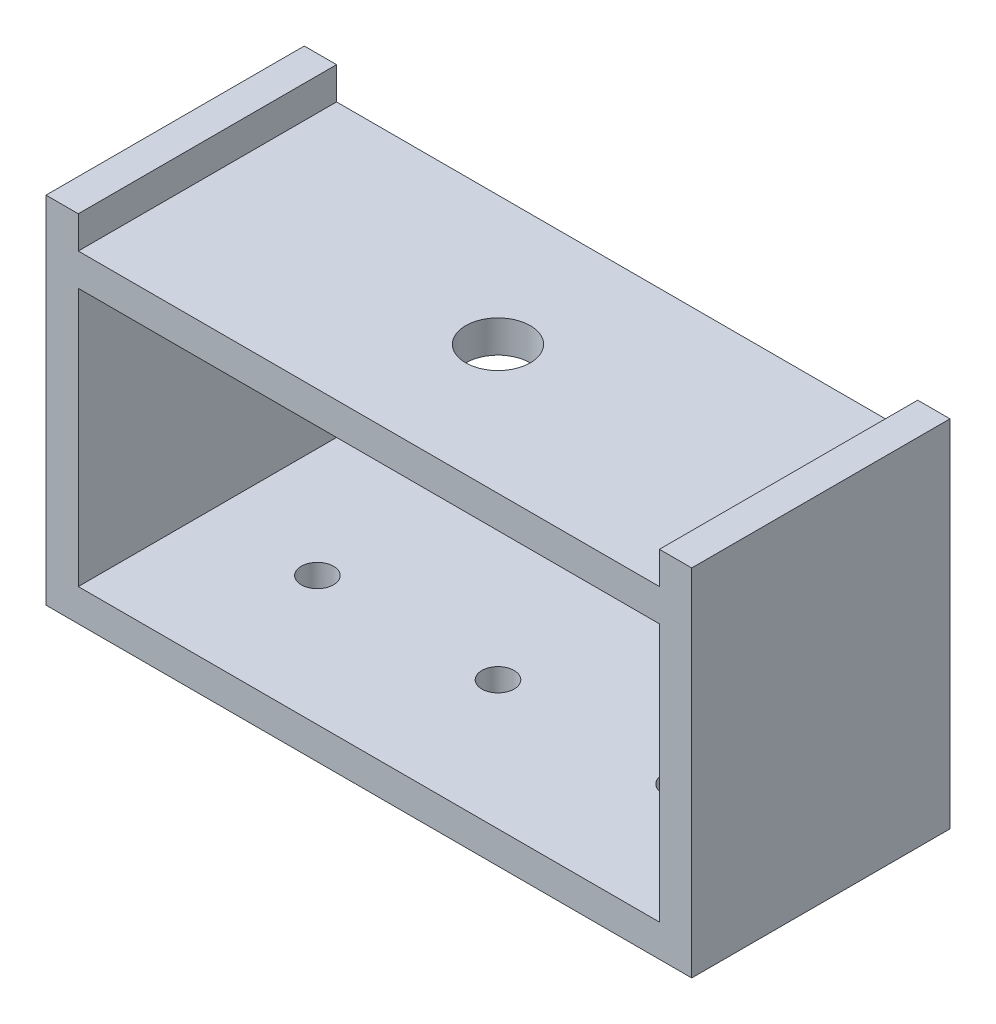
ISO-10303-21;
HEADER;
FILE_DESCRIPTION(('STEP AP214'),'2;1');
FILE_NAME('part.step','',(''),(''),'','','');
FILE_SCHEMA(('AUTOMOTIVE_DESIGN { 1 0 10303 214 1 1 1 1 }'));
ENDSEC;
DATA;
#1=APPLICATION_CONTEXT('core data for automotive mechanical design processes');
#2=APPLICATION_PROTOCOL_DEFINITION('international standard','automotive_design',2000,#1);
#3=PRODUCT_CONTEXT('',#1,'mechanical');
#4=PRODUCT('Part','Part','',(#3));
#5=PRODUCT_RELATED_PRODUCT_CATEGORY('part','',(#4));
#6=PRODUCT_DEFINITION_FORMATION('','',#4);
#7=PRODUCT_DEFINITION_CONTEXT('part definition',#1,'design');
#8=PRODUCT_DEFINITION('design','',#6,#7);
#9=PRODUCT_DEFINITION_SHAPE('','',#8);
#10=(LENGTH_UNIT() NAMED_UNIT(*) SI_UNIT(.MILLI.,.METRE.));
#11=(NAMED_UNIT(*) PLANE_ANGLE_UNIT() SI_UNIT($,.RADIAN.));
#12=(NAMED_UNIT(*) SI_UNIT($,.STERADIAN.) SOLID_ANGLE_UNIT());
#13=UNCERTAINTY_MEASURE_WITH_UNIT(LENGTH_MEASURE(1.E-05),#10,'distance_accuracy_value','');
#14=(GEOMETRIC_REPRESENTATION_CONTEXT(3) GLOBAL_UNCERTAINTY_ASSIGNED_CONTEXT((#13)) GLOBAL_UNIT_ASSIGNED_CONTEXT((#10,
#11,#12)) REPRESENTATION_CONTEXT('',''));
#15=CARTESIAN_POINT('',(0.,0.,0.));
#16=DIRECTION('',(0.,0.,1.));
#17=DIRECTION('',(1.,0.,0.));
#18=AXIS2_PLACEMENT_3D('',#15,#16,#17);
#19=CARTESIAN_POINT('',(127.,31.75,25.4));
#20=DIRECTION('',(0.,-1.,0.));
#21=DIRECTION('',(0.,0.,-1.));
#22=AXIS2_PLACEMENT_3D('',#19,#20,#21);
#23=PLANE('',#22);
#24=CARTESIAN_POINT('',(63.5,31.75,0.));
#25=DIRECTION('',(0.,1.,0.));
#26=DIRECTION('',(0.,0.,1.));
#27=AXIS2_PLACEMENT_3D('',#24,#25,#26);
#28=CIRCLE('',#27,6.35000000000001);
#29=CARTESIAN_POINT('',(63.5,31.75,6.35000000000001));
#30=VERTEX_POINT('',#29);
#31=EDGE_CURVE('E422',#30,#30,#28,.T.);
#32=ORIENTED_EDGE('',*,*,#31,.F.);
#33=EDGE_LOOP('',(#32));
#34=FACE_BOUND('',#33,.T.);
#35=DIRECTION('',(0.,0.,1.));
#36=VECTOR('',#35,1.);
#37=CARTESIAN_POINT('',(120.65,31.75,-25.4));
#38=LINE('',#37,#36);
#39=CARTESIAN_POINT('',(120.65,31.75,-25.4));
#40=VERTEX_POINT('',#39);
#41=CARTESIAN_POINT('',(120.65,31.75,25.4));
#42=VERTEX_POINT('',#41);
#43=EDGE_CURVE('E155',#40,#42,#38,.T.);
#44=ORIENTED_EDGE('',*,*,#43,.F.);
#45=DIRECTION('',(-1.,0.,0.));
#46=VECTOR('',#45,1.);
#47=CARTESIAN_POINT('',(127.,31.75,-25.4));
#48=LINE('',#47,#46);
#49=CARTESIAN_POINT('',(6.35,31.75,-25.4));
#50=VERTEX_POINT('',#49);
#51=EDGE_CURVE('E11',#40,#50,#48,.T.);
#52=ORIENTED_EDGE('',*,*,#51,.T.);
#53=DIRECTION('',(0.,0.,-1.));
#54=VECTOR('',#53,1.);
#55=CARTESIAN_POINT('',(6.35,31.75,-25.4));
#56=LINE('',#55,#54);
#57=CARTESIAN_POINT('',(6.35000000000001,31.75,25.4));
#58=VERTEX_POINT('',#57);
#59=EDGE_CURVE('E174',#58,#50,#56,.T.);
#60=ORIENTED_EDGE('',*,*,#59,.F.);
#61=DIRECTION('',(-1.,0.,0.));
#62=VECTOR('',#61,1.);
#63=CARTESIAN_POINT('',(127.,31.75,25.4));
#64=LINE('',#63,#62);
#65=EDGE_CURVE('E41',#42,#58,#64,.T.);
#66=ORIENTED_EDGE('',*,*,#65,.F.);
#67=EDGE_LOOP('',(#44,#52,#60,#66));
#68=FACE_BOUND('',#67,.T.);
#69=ADVANCED_FACE('F33',(#34,#68),#23,.F.);
#70=CARTESIAN_POINT('',(127.,-31.75,-25.4));
#71=DIRECTION('',(0.,0.,1.));
#72=DIRECTION('',(1.,0.,0.));
#73=AXIS2_PLACEMENT_3D('',#70,#71,#72);
#74=PLANE('',#73);
#75=DIRECTION('',(0.,1.,0.));
#76=VECTOR('',#75,1.);
#77=CARTESIAN_POINT('',(120.65,-25.4,-25.4));
#78=LINE('',#77,#76);
#79=CARTESIAN_POINT('',(120.65,-25.4,-25.4));
#80=VERTEX_POINT('',#79);
#81=CARTESIAN_POINT('',(120.65,25.4,-25.4));
#82=VERTEX_POINT('',#81);
#83=EDGE_CURVE('E150',#80,#82,#78,.T.);
#84=ORIENTED_EDGE('',*,*,#83,.T.);
#85=DIRECTION('',(-1.,0.,0.));
#86=VECTOR('',#85,1.);
#87=CARTESIAN_POINT('',(120.65,25.4,-25.4));
#88=LINE('',#87,#86);
#89=CARTESIAN_POINT('',(6.35,25.4,-25.4));
#90=VERTEX_POINT('',#89);
#91=EDGE_CURVE('E141',#82,#90,#88,.T.);
#92=ORIENTED_EDGE('',*,*,#91,.T.);
#93=DIRECTION('',(0.,-1.,0.));
#94=VECTOR('',#93,1.);
#95=CARTESIAN_POINT('',(6.35,25.4,-25.4));
#96=LINE('',#95,#94);
#97=CARTESIAN_POINT('',(6.34999999999999,-25.4,-25.4));
#98=VERTEX_POINT('',#97);
#99=EDGE_CURVE('E147',#90,#98,#96,.T.);
#100=ORIENTED_EDGE('',*,*,#99,.T.);
#101=DIRECTION('',(1.,0.,0.));
#102=VECTOR('',#101,1.);
#103=CARTESIAN_POINT('',(6.35000000000001,-25.4,-25.4));
#104=LINE('',#103,#102);
#105=EDGE_CURVE('E48',#98,#80,#104,.T.);
#106=ORIENTED_EDGE('',*,*,#105,.T.);
#107=EDGE_LOOP('',(#84,#92,#100,#106));
#108=FACE_BOUND('',#107,.T.);
#109=DIRECTION('',(0.,1.,0.));
#110=VECTOR('',#109,1.);
#111=CARTESIAN_POINT('',(0.,-31.75,-25.4));
#112=LINE('',#111,#110);
#113=CARTESIAN_POINT('',(0.,-31.75,-25.4));
#114=VERTEX_POINT('',#113);
#115=CARTESIAN_POINT('',(0.,38.1,-25.4));
#116=VERTEX_POINT('',#115);
#117=EDGE_CURVE('E193',#114,#116,#112,.T.);
#118=ORIENTED_EDGE('',*,*,#117,.T.);
#119=DIRECTION('',(-1.,0.,0.));
#120=VECTOR('',#119,1.);
#121=CARTESIAN_POINT('',(0.,38.1,-25.4));
#122=LINE('',#121,#120);
#123=CARTESIAN_POINT('',(6.35,38.1,-25.4));
#124=VERTEX_POINT('',#123);
#125=EDGE_CURVE('E182',#124,#116,#122,.T.);
#126=ORIENTED_EDGE('',*,*,#125,.F.);
#127=DIRECTION('',(0.,-1.,0.));
#128=VECTOR('',#127,1.);
#129=CARTESIAN_POINT('',(6.35,38.1,-25.4));
#130=LINE('',#129,#128);
#131=EDGE_CURVE('E185',#124,#50,#130,.T.);
#132=ORIENTED_EDGE('',*,*,#131,.T.);
#133=ORIENTED_EDGE('',*,*,#51,.F.);
#134=DIRECTION('',(0.,-1.,0.));
#135=VECTOR('',#134,1.);
#136=CARTESIAN_POINT('',(120.65,38.1,-25.4));
#137=LINE('',#136,#135);
#138=CARTESIAN_POINT('',(120.65,38.1,-25.4));
#139=VERTEX_POINT('',#138);
#140=EDGE_CURVE('E172',#139,#40,#137,.T.);
#141=ORIENTED_EDGE('',*,*,#140,.F.);
#142=DIRECTION('',(-1.,0.,0.));
#143=VECTOR('',#142,1.);
#144=CARTESIAN_POINT('',(127.,38.1,-25.4));
#145=LINE('',#144,#143);
#146=CARTESIAN_POINT('',(127.,38.1,-25.4));
#147=VERTEX_POINT('',#146);
#148=EDGE_CURVE('E161',#147,#139,#145,.T.);
#149=ORIENTED_EDGE('',*,*,#148,.F.);
#150=DIRECTION('',(0.,1.,0.));
#151=VECTOR('',#150,1.);
#152=CARTESIAN_POINT('',(127.,-31.75,-25.4));
#153=LINE('',#152,#151);
#154=CARTESIAN_POINT('',(127.,-31.75,-25.4));
#155=VERTEX_POINT('',#154);
#156=EDGE_CURVE('E194',#155,#147,#153,.T.);
#157=ORIENTED_EDGE('',*,*,#156,.F.);
#158=DIRECTION('',(-1.,0.,0.));
#159=VECTOR('',#158,1.);
#160=CARTESIAN_POINT('',(127.,-31.75,-25.4));
#161=LINE('',#160,#159);
#162=EDGE_CURVE('E201',#155,#114,#161,.T.);
#163=ORIENTED_EDGE('',*,*,#162,.T.);
#164=EDGE_LOOP('',(#118,#126,#132,#133,#141,#149,#157,#163));
#165=FACE_BOUND('',#164,.T.);
#166=ADVANCED_FACE('F35',(#108,#165),#74,.F.);
#167=CARTESIAN_POINT('',(127.,-31.75,25.4));
#168=DIRECTION('',(0.,0.,-1.));
#169=DIRECTION('',(-1.,0.,0.));
#170=AXIS2_PLACEMENT_3D('',#167,#168,#169);
#171=PLANE('',#170);
#172=DIRECTION('',(0.,-1.,0.));
#173=VECTOR('',#172,1.);
#174=CARTESIAN_POINT('',(6.35,25.4,25.4));
#175=LINE('',#174,#173);
#176=CARTESIAN_POINT('',(6.34999999999999,25.4,25.4));
#177=VERTEX_POINT('',#176);
#178=CARTESIAN_POINT('',(6.35000000000001,-25.4,25.4));
#179=VERTEX_POINT('',#178);
#180=EDGE_CURVE('E132',#177,#179,#175,.T.);
#181=ORIENTED_EDGE('',*,*,#180,.F.);
#182=DIRECTION('',(-1.,0.,0.));
#183=VECTOR('',#182,1.);
#184=CARTESIAN_POINT('',(120.65,25.4,25.4));
#185=LINE('',#184,#183);
#186=CARTESIAN_POINT('',(120.65,25.4,25.4));
#187=VERTEX_POINT('',#186);
#188=EDGE_CURVE('E56',#187,#177,#185,.T.);
#189=ORIENTED_EDGE('',*,*,#188,.F.);
#190=DIRECTION('',(0.,1.,0.));
#191=VECTOR('',#190,1.);
#192=CARTESIAN_POINT('',(120.65,-25.4,25.4));
#193=LINE('',#192,#191);
#194=CARTESIAN_POINT('',(120.65,-25.4,25.4));
#195=VERTEX_POINT('',#194);
#196=EDGE_CURVE('E139',#195,#187,#193,.T.);
#197=ORIENTED_EDGE('',*,*,#196,.F.);
#198=DIRECTION('',(1.,0.,0.));
#199=VECTOR('',#198,1.);
#200=CARTESIAN_POINT('',(6.35000000000001,-25.4,25.4));
#201=LINE('',#200,#199);
#202=EDGE_CURVE('E123',#179,#195,#201,.T.);
#203=ORIENTED_EDGE('',*,*,#202,.F.);
#204=EDGE_LOOP('',(#181,#189,#197,#203));
#205=FACE_BOUND('',#204,.T.);
#206=DIRECTION('',(0.,-1.,0.));
#207=VECTOR('',#206,1.);
#208=CARTESIAN_POINT('',(0.,-31.75,25.4));
#209=LINE('',#208,#207);
#210=CARTESIAN_POINT('',(0.,38.1,25.4));
#211=VERTEX_POINT('',#210);
#212=CARTESIAN_POINT('',(0.,-31.75,25.4));
#213=VERTEX_POINT('',#212);
#214=EDGE_CURVE('E203',#211,#213,#209,.T.);
#215=ORIENTED_EDGE('',*,*,#214,.T.);
#216=DIRECTION('',(-1.,0.,0.));
#217=VECTOR('',#216,1.);
#218=CARTESIAN_POINT('',(127.,-31.75,25.4));
#219=LINE('',#218,#217);
#220=CARTESIAN_POINT('',(127.,-31.75,25.4));
#221=VERTEX_POINT('',#220);
#222=EDGE_CURVE('E208',#221,#213,#219,.T.);
#223=ORIENTED_EDGE('',*,*,#222,.F.);
#224=DIRECTION('',(0.,-1.,0.));
#225=VECTOR('',#224,1.);
#226=CARTESIAN_POINT('',(127.,-31.75,25.4));
#227=LINE('',#226,#225);
#228=CARTESIAN_POINT('',(127.,38.1,25.4));
#229=VERTEX_POINT('',#228);
#230=EDGE_CURVE('E196',#229,#221,#227,.T.);
#231=ORIENTED_EDGE('',*,*,#230,.F.);
#232=DIRECTION('',(1.,0.,0.));
#233=VECTOR('',#232,1.);
#234=CARTESIAN_POINT('',(127.,38.1,25.4));
#235=LINE('',#234,#233);
#236=CARTESIAN_POINT('',(120.65,38.1,25.4));
#237=VERTEX_POINT('',#236);
#238=EDGE_CURVE('E165',#237,#229,#235,.T.);
#239=ORIENTED_EDGE('',*,*,#238,.F.);
#240=DIRECTION('',(0.,-1.,0.));
#241=VECTOR('',#240,1.);
#242=CARTESIAN_POINT('',(120.65,38.1,25.4));
#243=LINE('',#242,#241);
#244=EDGE_CURVE('E168',#237,#42,#243,.T.);
#245=ORIENTED_EDGE('',*,*,#244,.T.);
#246=ORIENTED_EDGE('',*,*,#65,.T.);
#247=DIRECTION('',(0.,-1.,0.));
#248=VECTOR('',#247,1.);
#249=CARTESIAN_POINT('',(6.35000000000001,38.1,25.4));
#250=LINE('',#249,#248);
#251=CARTESIAN_POINT('',(6.35000000000001,38.1,25.4));
#252=VERTEX_POINT('',#251);
#253=EDGE_CURVE('E190',#252,#58,#250,.T.);
#254=ORIENTED_EDGE('',*,*,#253,.F.);
#255=DIRECTION('',(1.,0.,0.));
#256=VECTOR('',#255,1.);
#257=CARTESIAN_POINT('',(0.,38.1,25.4));
#258=LINE('',#257,#256);
#259=EDGE_CURVE('E178',#211,#252,#258,.T.);
#260=ORIENTED_EDGE('',*,*,#259,.F.);
#261=EDGE_LOOP('',(#215,#223,#231,#239,#245,#246,#254,#260));
#262=FACE_BOUND('',#261,.T.);
#263=ADVANCED_FACE('F136',(#205,#262),#171,.F.);
#264=CARTESIAN_POINT('',(127.,-31.75,25.4));
#265=DIRECTION('',(0.,1.,0.));
#266=DIRECTION('',(0.,0.,1.));
#267=AXIS2_PLACEMENT_3D('',#264,#265,#266);
#268=PLANE('',#267);
#269=CARTESIAN_POINT('',(99.0166485277494,-31.75,0.));
#270=DIRECTION('',(0.,1.,0.));
#271=DIRECTION('',(0.,0.,1.));
#272=AXIS2_PLACEMENT_3D('',#269,#270,#271);
#273=CIRCLE('',#272,3.175);
#274=CARTESIAN_POINT('',(99.0166485277494,-31.75,3.175));
#275=VERTEX_POINT('',#274);
#276=EDGE_CURVE('E407',#275,#275,#273,.F.);
#277=ORIENTED_EDGE('',*,*,#276,.F.);
#278=EDGE_LOOP('',(#277));
#279=FACE_BOUND('',#278,.T.);
#280=CARTESIAN_POINT('',(27.9833514722506,-31.75,0.));
#281=DIRECTION('',(0.,1.,0.));
#282=DIRECTION('',(0.,0.,1.));
#283=AXIS2_PLACEMENT_3D('',#280,#281,#282);
#284=CIRCLE('',#283,3.175);
#285=CARTESIAN_POINT('',(27.9833514722506,-31.75,3.175));
#286=VERTEX_POINT('',#285);
#287=EDGE_CURVE('E411',#286,#286,#284,.F.);
#288=ORIENTED_EDGE('',*,*,#287,.F.);
#289=EDGE_LOOP('',(#288));
#290=FACE_BOUND('',#289,.T.);
#291=CARTESIAN_POINT('',(63.5,-31.75,0.));
#292=DIRECTION('',(0.,1.,0.));
#293=DIRECTION('',(0.,0.,1.));
#294=AXIS2_PLACEMENT_3D('',#291,#292,#293);
#295=CIRCLE('',#294,3.175);
#296=CARTESIAN_POINT('',(63.5,-31.75,3.175));
#297=VERTEX_POINT('',#296);
#298=EDGE_CURVE('E419',#297,#297,#295,.F.);
#299=ORIENTED_EDGE('',*,*,#298,.F.);
#300=EDGE_LOOP('',(#299));
#301=FACE_BOUND('',#300,.T.);
#302=DIRECTION('',(0.,0.,-1.));
#303=VECTOR('',#302,1.);
#304=CARTESIAN_POINT('',(0.,-31.75,25.4));
#305=LINE('',#304,#303);
#306=EDGE_CURVE('E197',#213,#114,#305,.T.);
#307=ORIENTED_EDGE('',*,*,#306,.T.);
#308=ORIENTED_EDGE('',*,*,#162,.F.);
#309=DIRECTION('',(0.,0.,-1.));
#310=VECTOR('',#309,1.);
#311=CARTESIAN_POINT('',(127.,-31.75,25.4));
#312=LINE('',#311,#310);
#313=EDGE_CURVE('E199',#221,#155,#312,.T.);
#314=ORIENTED_EDGE('',*,*,#313,.F.);
#315=ORIENTED_EDGE('',*,*,#222,.T.);
#316=EDGE_LOOP('',(#307,#308,#314,#315));
#317=FACE_BOUND('',#316,.T.);
#318=ADVANCED_FACE('F232',(#279,#290,#301,#317),#268,.F.);
#319=CARTESIAN_POINT('',(127.,0.,0.));
#320=DIRECTION('',(-1.,0.,0.));
#321=DIRECTION('',(0.,0.,1.));
#322=AXIS2_PLACEMENT_3D('',#319,#320,#321);
#323=PLANE('',#322);
#324=ORIENTED_EDGE('',*,*,#156,.T.);
#325=DIRECTION('',(0.,0.,-1.));
#326=VECTOR('',#325,1.);
#327=CARTESIAN_POINT('',(127.,38.1,-25.4));
#328=LINE('',#327,#326);
#329=EDGE_CURVE('E158',#229,#147,#328,.T.);
#330=ORIENTED_EDGE('',*,*,#329,.F.);
#331=ORIENTED_EDGE('',*,*,#230,.T.);
#332=ORIENTED_EDGE('',*,*,#313,.T.);
#333=EDGE_LOOP('',(#324,#330,#331,#332));
#334=FACE_BOUND('',#333,.T.);
#335=ADVANCED_FACE('F242',(#334),#323,.F.);
#336=CARTESIAN_POINT('',(0.,0.,0.));
#337=DIRECTION('',(-1.,0.,0.));
#338=DIRECTION('',(0.,0.,1.));
#339=AXIS2_PLACEMENT_3D('',#336,#337,#338);
#340=PLANE('',#339);
#341=ORIENTED_EDGE('',*,*,#117,.F.);
#342=ORIENTED_EDGE('',*,*,#306,.F.);
#343=ORIENTED_EDGE('',*,*,#214,.F.);
#344=DIRECTION('',(0.,0.,1.));
#345=VECTOR('',#344,1.);
#346=CARTESIAN_POINT('',(0.,38.1,-25.4));
#347=LINE('',#346,#345);
#348=EDGE_CURVE('E175',#116,#211,#347,.T.);
#349=ORIENTED_EDGE('',*,*,#348,.F.);
#350=EDGE_LOOP('',(#341,#342,#343,#349));
#351=FACE_BOUND('',#350,.T.);
#352=ADVANCED_FACE('F235',(#351),#340,.T.);
#353=CARTESIAN_POINT('',(6.35,38.1,-25.4));
#354=DIRECTION('',(-1.,0.,0.));
#355=DIRECTION('',(0.,0.,1.));
#356=AXIS2_PLACEMENT_3D('',#353,#354,#355);
#357=PLANE('',#356);
#358=ORIENTED_EDGE('',*,*,#59,.T.);
#359=ORIENTED_EDGE('',*,*,#131,.F.);
#360=DIRECTION('',(0.,0.,-1.));
#361=VECTOR('',#360,1.);
#362=CARTESIAN_POINT('',(6.35,38.1,-25.4));
#363=LINE('',#362,#361);
#364=EDGE_CURVE('E180',#252,#124,#363,.T.);
#365=ORIENTED_EDGE('',*,*,#364,.F.);
#366=ORIENTED_EDGE('',*,*,#253,.T.);
#367=EDGE_LOOP('',(#358,#359,#365,#366));
#368=FACE_BOUND('',#367,.T.);
#369=ADVANCED_FACE('F222',(#368),#357,.F.);
#370=CARTESIAN_POINT('',(0.,38.1,0.));
#371=DIRECTION('',(0.,1.,0.));
#372=DIRECTION('',(0.,0.,1.));
#373=AXIS2_PLACEMENT_3D('',#370,#371,#372);
#374=PLANE('',#373);
#375=ORIENTED_EDGE('',*,*,#348,.T.);
#376=ORIENTED_EDGE('',*,*,#259,.T.);
#377=ORIENTED_EDGE('',*,*,#364,.T.);
#378=ORIENTED_EDGE('',*,*,#125,.T.);
#379=EDGE_LOOP('',(#375,#376,#377,#378));
#380=FACE_BOUND('',#379,.T.);
#381=ADVANCED_FACE('F225',(#380),#374,.T.);
#382=CARTESIAN_POINT('',(120.65,38.1,-25.4));
#383=DIRECTION('',(1.,0.,0.));
#384=DIRECTION('',(0.,0.,-1.));
#385=AXIS2_PLACEMENT_3D('',#382,#383,#384);
#386=PLANE('',#385);
#387=ORIENTED_EDGE('',*,*,#43,.T.);
#388=ORIENTED_EDGE('',*,*,#244,.F.);
#389=DIRECTION('',(0.,0.,1.));
#390=VECTOR('',#389,1.);
#391=CARTESIAN_POINT('',(120.65,38.1,-25.4));
#392=LINE('',#391,#390);
#393=EDGE_CURVE('E163',#139,#237,#392,.T.);
#394=ORIENTED_EDGE('',*,*,#393,.F.);
#395=ORIENTED_EDGE('',*,*,#140,.T.);
#396=EDGE_LOOP('',(#387,#388,#394,#395));
#397=FACE_BOUND('',#396,.T.);
#398=ADVANCED_FACE('F247',(#397),#386,.F.);
#399=CARTESIAN_POINT('',(0.,38.1,0.));
#400=DIRECTION('',(0.,-1.,0.));
#401=DIRECTION('',(0.,0.,-1.));
#402=AXIS2_PLACEMENT_3D('',#399,#400,#401);
#403=PLANE('',#402);
#404=ORIENTED_EDGE('',*,*,#329,.T.);
#405=ORIENTED_EDGE('',*,*,#148,.T.);
#406=ORIENTED_EDGE('',*,*,#393,.T.);
#407=ORIENTED_EDGE('',*,*,#238,.T.);
#408=EDGE_LOOP('',(#404,#405,#406,#407));
#409=FACE_BOUND('',#408,.T.);
#410=ADVANCED_FACE('F244',(#409),#403,.F.);
#411=CARTESIAN_POINT('',(120.65,25.4,-25.4));
#412=DIRECTION('',(0.,1.,0.));
#413=DIRECTION('',(-1.,0.,0.));
#414=AXIS2_PLACEMENT_3D('',#411,#412,#413);
#415=PLANE('',#414);
#416=CARTESIAN_POINT('',(63.5,25.4,0.));
#417=DIRECTION('',(0.,1.,0.));
#418=DIRECTION('',(-1.,0.,0.));
#419=AXIS2_PLACEMENT_3D('',#416,#417,#418);
#420=CIRCLE('',#419,6.35000000000001);
#421=CARTESIAN_POINT('',(57.15,25.4,0.));
#422=VERTEX_POINT('',#421);
#423=EDGE_CURVE('E425',#422,#422,#420,.F.);
#424=ORIENTED_EDGE('',*,*,#423,.F.);
#425=EDGE_LOOP('',(#424));
#426=FACE_BOUND('',#425,.T.);
#427=DIRECTION('',(0.,0.,1.));
#428=VECTOR('',#427,1.);
#429=CARTESIAN_POINT('',(6.35,25.4,-25.4));
#430=LINE('',#429,#428);
#431=EDGE_CURVE('E129',#90,#177,#430,.T.);
#432=ORIENTED_EDGE('',*,*,#431,.F.);
#433=ORIENTED_EDGE('',*,*,#91,.F.);
#434=DIRECTION('',(0.,0.,1.));
#435=VECTOR('',#434,1.);
#436=CARTESIAN_POINT('',(120.65,25.4,-25.4));
#437=LINE('',#436,#435);
#438=EDGE_CURVE('E153',#82,#187,#437,.T.);
#439=ORIENTED_EDGE('',*,*,#438,.T.);
#440=ORIENTED_EDGE('',*,*,#188,.T.);
#441=EDGE_LOOP('',(#432,#433,#439,#440));
#442=FACE_BOUND('',#441,.T.);
#443=ADVANCED_FACE('F254',(#426,#442),#415,.F.);
#444=CARTESIAN_POINT('',(120.65,-25.4,-25.4));
#445=DIRECTION('',(1.,0.,0.));
#446=DIRECTION('',(0.,0.,-1.));
#447=AXIS2_PLACEMENT_3D('',#444,#445,#446);
#448=PLANE('',#447);
#449=ORIENTED_EDGE('',*,*,#438,.F.);
#450=ORIENTED_EDGE('',*,*,#83,.F.);
#451=DIRECTION('',(0.,0.,1.));
#452=VECTOR('',#451,1.);
#453=CARTESIAN_POINT('',(120.65,-25.4,-25.4));
#454=LINE('',#453,#452);
#455=EDGE_CURVE('E128',#80,#195,#454,.T.);
#456=ORIENTED_EDGE('',*,*,#455,.T.);
#457=ORIENTED_EDGE('',*,*,#196,.T.);
#458=EDGE_LOOP('',(#449,#450,#456,#457));
#459=FACE_BOUND('',#458,.T.);
#460=ADVANCED_FACE('F315',(#459),#448,.F.);
#461=CARTESIAN_POINT('',(6.35000000000001,-25.4,-25.4));
#462=DIRECTION('',(0.,-1.,0.));
#463=DIRECTION('',(1.,0.,0.));
#464=AXIS2_PLACEMENT_3D('',#461,#462,#463);
#465=PLANE('',#464);
#466=CARTESIAN_POINT('',(99.0166485277494,-25.4,0.));
#467=DIRECTION('',(0.,1.,0.));
#468=DIRECTION('',(1.,0.,0.));
#469=AXIS2_PLACEMENT_3D('',#466,#467,#468);
#470=CIRCLE('',#469,3.175);
#471=CARTESIAN_POINT('',(102.191648527749,-25.4,0.));
#472=VERTEX_POINT('',#471);
#473=EDGE_CURVE('E404',#472,#472,#470,.T.);
#474=ORIENTED_EDGE('',*,*,#473,.F.);
#475=EDGE_LOOP('',(#474));
#476=FACE_BOUND('',#475,.T.);
#477=CARTESIAN_POINT('',(27.9833514722506,-25.4,0.));
#478=DIRECTION('',(0.,1.,0.));
#479=DIRECTION('',(-1.,0.,0.));
#480=AXIS2_PLACEMENT_3D('',#477,#478,#479);
#481=CIRCLE('',#480,3.175);
#482=CARTESIAN_POINT('',(24.8083514722506,-25.4,0.));
#483=VERTEX_POINT('',#482);
#484=EDGE_CURVE('E408',#483,#483,#481,.T.);
#485=ORIENTED_EDGE('',*,*,#484,.F.);
#486=EDGE_LOOP('',(#485));
#487=FACE_BOUND('',#486,.T.);
#488=CARTESIAN_POINT('',(63.5,-25.4,0.));
#489=DIRECTION('',(0.,1.,0.));
#490=DIRECTION('',(-1.,0.,0.));
#491=AXIS2_PLACEMENT_3D('',#488,#489,#490);
#492=CIRCLE('',#491,3.175);
#493=CARTESIAN_POINT('',(60.325,-25.4,0.));
#494=VERTEX_POINT('',#493);
#495=EDGE_CURVE('E416',#494,#494,#492,.T.);
#496=ORIENTED_EDGE('',*,*,#495,.F.);
#497=EDGE_LOOP('',(#496));
#498=FACE_BOUND('',#497,.T.);
#499=ORIENTED_EDGE('',*,*,#455,.F.);
#500=ORIENTED_EDGE('',*,*,#105,.F.);
#501=DIRECTION('',(0.,0.,1.));
#502=VECTOR('',#501,1.);
#503=CARTESIAN_POINT('',(6.35000000000001,-25.4,-25.4));
#504=LINE('',#503,#502);
#505=EDGE_CURVE('E119',#98,#179,#504,.T.);
#506=ORIENTED_EDGE('',*,*,#505,.T.);
#507=ORIENTED_EDGE('',*,*,#202,.T.);
#508=EDGE_LOOP('',(#499,#500,#506,#507));
#509=FACE_BOUND('',#508,.T.);
#510=ADVANCED_FACE('F121',(#476,#487,#498,#509),#465,.F.);
#511=CARTESIAN_POINT('',(6.35,25.4,-25.4));
#512=DIRECTION('',(-1.,0.,0.));
#513=DIRECTION('',(0.,-1.,0.));
#514=AXIS2_PLACEMENT_3D('',#511,#512,#513);
#515=PLANE('',#514);
#516=ORIENTED_EDGE('',*,*,#505,.F.);
#517=ORIENTED_EDGE('',*,*,#99,.F.);
#518=ORIENTED_EDGE('',*,*,#431,.T.);
#519=ORIENTED_EDGE('',*,*,#180,.T.);
#520=EDGE_LOOP('',(#516,#517,#518,#519));
#521=FACE_BOUND('',#520,.T.);
#522=ADVANCED_FACE('F133',(#521),#515,.F.);
#523=CARTESIAN_POINT('',(63.5,-31.751,0.));
#524=DIRECTION('',(0.,1.,0.));
#525=DIRECTION('',(0.,0.,1.));
#526=AXIS2_PLACEMENT_3D('',#523,#524,#525);
#527=CYLINDRICAL_SURFACE('',#526,6.35000000000001);
#528=ORIENTED_EDGE('',*,*,#31,.T.);
#529=EDGE_LOOP('',(#528));
#530=FACE_BOUND('',#529,.T.);
#531=ORIENTED_EDGE('',*,*,#423,.T.);
#532=EDGE_LOOP('',(#531));
#533=FACE_BOUND('',#532,.T.);
#534=ADVANCED_FACE('F330',(#530,#533),#527,.F.);
#535=CARTESIAN_POINT('',(63.5,-31.751,0.));
#536=DIRECTION('',(0.,1.,0.));
#537=DIRECTION('',(-1.,0.,0.));
#538=AXIS2_PLACEMENT_3D('',#535,#536,#537);
#539=CYLINDRICAL_SURFACE('',#538,3.175);
#540=ORIENTED_EDGE('',*,*,#495,.T.);
#541=EDGE_LOOP('',(#540));
#542=FACE_BOUND('',#541,.T.);
#543=ORIENTED_EDGE('',*,*,#298,.T.);
#544=EDGE_LOOP('',(#543));
#545=FACE_BOUND('',#544,.T.);
#546=ADVANCED_FACE('F352',(#542,#545),#539,.F.);
#547=CARTESIAN_POINT('',(27.9833514722506,-31.751,0.));
#548=DIRECTION('',(0.,1.,0.));
#549=DIRECTION('',(-1.,0.,0.));
#550=AXIS2_PLACEMENT_3D('',#547,#548,#549);
#551=CYLINDRICAL_SURFACE('',#550,3.175);
#552=ORIENTED_EDGE('',*,*,#484,.T.);
#553=EDGE_LOOP('',(#552));
#554=FACE_BOUND('',#553,.T.);
#555=ORIENTED_EDGE('',*,*,#287,.T.);
#556=EDGE_LOOP('',(#555));
#557=FACE_BOUND('',#556,.T.);
#558=ADVANCED_FACE('F377',(#554,#557),#551,.F.);
#559=CARTESIAN_POINT('',(99.0166485277494,-31.751,0.));
#560=DIRECTION('',(0.,1.,0.));
#561=DIRECTION('',(-1.,0.,0.));
#562=AXIS2_PLACEMENT_3D('',#559,#560,#561);
#563=CYLINDRICAL_SURFACE('',#562,3.175);
#564=ORIENTED_EDGE('',*,*,#473,.T.);
#565=EDGE_LOOP('',(#564));
#566=FACE_BOUND('',#565,.T.);
#567=ORIENTED_EDGE('',*,*,#276,.T.);
#568=EDGE_LOOP('',(#567));
#569=FACE_BOUND('',#568,.T.);
#570=ADVANCED_FACE('F387',(#566,#569),#563,.F.);
#571=CLOSED_SHELL('',(#69,#166,#263,#318,#335,#352,#369,#381,#398,#410,#443,#460,#510,#522,#534,
#546,#558,#570));
#572=MANIFOLD_SOLID_BREP('B2',#571);
#573=ADVANCED_BREP_SHAPE_REPRESENTATION('',(#18,#572),#14);
#574=SHAPE_DEFINITION_REPRESENTATION(#9,#573);
ENDSEC;
END-ISO-10303-21;
